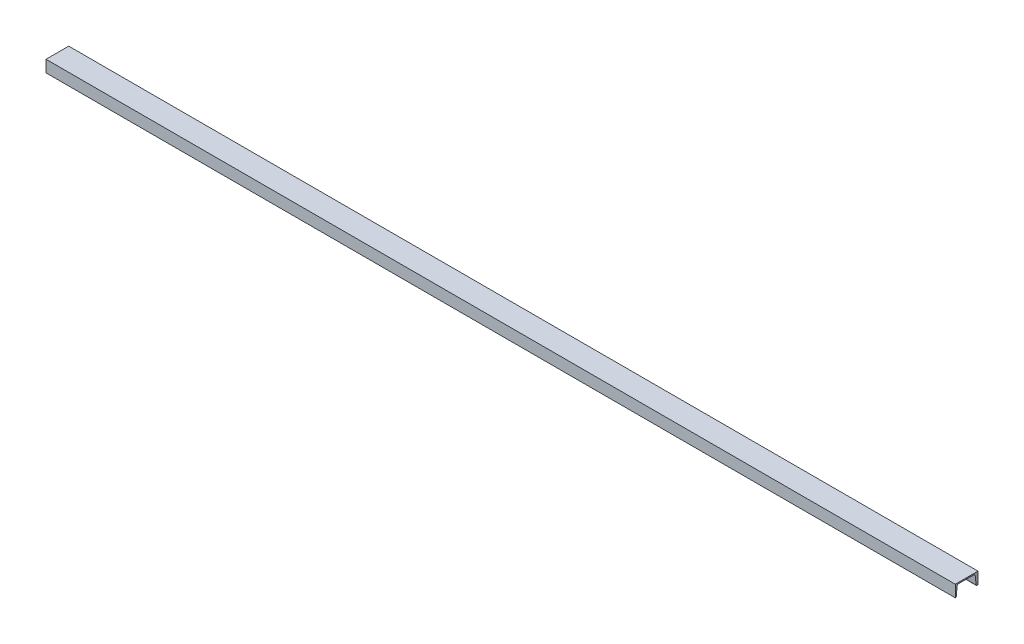
ISO-10303-21;
HEADER;
FILE_DESCRIPTION(('STEP AP214'),'2;1');
FILE_NAME('part.step','',(''),(''),'','','');
FILE_SCHEMA(('AUTOMOTIVE_DESIGN { 1 0 10303 214 1 1 1 1 }'));
ENDSEC;
DATA;
#1=APPLICATION_CONTEXT('core data for automotive mechanical design processes');
#2=APPLICATION_PROTOCOL_DEFINITION('international standard','automotive_design',2000,#1);
#3=PRODUCT_CONTEXT('',#1,'mechanical');
#4=PRODUCT('Part','Part','',(#3));
#5=PRODUCT_RELATED_PRODUCT_CATEGORY('part','',(#4));
#6=PRODUCT_DEFINITION_FORMATION('','',#4);
#7=PRODUCT_DEFINITION_CONTEXT('part definition',#1,'design');
#8=PRODUCT_DEFINITION('design','',#6,#7);
#9=PRODUCT_DEFINITION_SHAPE('','',#8);
#10=(LENGTH_UNIT() NAMED_UNIT(*) SI_UNIT(.MILLI.,.METRE.));
#11=(NAMED_UNIT(*) PLANE_ANGLE_UNIT() SI_UNIT($,.RADIAN.));
#12=(NAMED_UNIT(*) SI_UNIT($,.STERADIAN.) SOLID_ANGLE_UNIT());
#13=UNCERTAINTY_MEASURE_WITH_UNIT(LENGTH_MEASURE(1.E-05),#10,'distance_accuracy_value','');
#14=(GEOMETRIC_REPRESENTATION_CONTEXT(3) GLOBAL_UNCERTAINTY_ASSIGNED_CONTEXT((#13)) GLOBAL_UNIT_ASSIGNED_CONTEXT((#10,
#11,#12)) REPRESENTATION_CONTEXT('',''));
#15=CARTESIAN_POINT('',(0.,0.,0.));
#16=DIRECTION('',(0.,0.,1.));
#17=DIRECTION('',(1.,0.,0.));
#18=AXIS2_PLACEMENT_3D('',#15,#16,#17);
#19=CARTESIAN_POINT('',(-5005.,-60.5,124.164669163818));
#20=DIRECTION('',(1.,0.,0.));
#21=DIRECTION('',(0.,0.,-1.));
#22=AXIS2_PLACEMENT_3D('',#19,#20,#21);
#23=CYLINDRICAL_SURFACE('',#22,4.5);
#24=CARTESIAN_POINT('',(0.,-60.5,124.164669163818));
#25=DIRECTION('',(-1.,0.,0.));
#26=DIRECTION('',(0.,0.,1.));
#27=AXIS2_PLACEMENT_3D('',#24,#25,#26);
#28=CIRCLE('',#27,4.5);
#29=CARTESIAN_POINT('',(0.,-60.9703780847044,119.689320634661));
#30=VERTEX_POINT('',#29);
#31=CARTESIAN_POINT('',(0.,-65.,124.164669163818));
#32=VERTEX_POINT('',#31);
#33=EDGE_CURVE('E200',#30,#32,#28,.T.);
#34=ORIENTED_EDGE('',*,*,#33,.T.);
#35=DIRECTION('',(1.,0.,0.));
#36=VECTOR('',#35,1.);
#37=CARTESIAN_POINT('',(-5005.,-65.,124.164669163818));
#38=LINE('',#37,#36);
#39=CARTESIAN_POINT('',(-5005.,-65.,124.164669163818));
#40=VERTEX_POINT('',#39);
#41=EDGE_CURVE('E13',#40,#32,#38,.T.);
#42=ORIENTED_EDGE('',*,*,#41,.F.);
#43=CARTESIAN_POINT('',(-5005.,-60.5,124.164669163818));
#44=DIRECTION('',(-1.,0.,0.));
#45=DIRECTION('',(0.,0.,1.));
#46=AXIS2_PLACEMENT_3D('',#43,#44,#45);
#47=CIRCLE('',#46,4.5);
#48=CARTESIAN_POINT('',(-5005.,-60.9703780847044,119.689320634661));
#49=VERTEX_POINT('',#48);
#50=EDGE_CURVE('E222',#49,#40,#47,.T.);
#51=ORIENTED_EDGE('',*,*,#50,.F.);
#52=DIRECTION('',(1.,0.,0.));
#53=VECTOR('',#52,1.);
#54=CARTESIAN_POINT('',(-5005.,-60.9703780847044,119.689320634661));
#55=LINE('',#54,#53);
#56=EDGE_CURVE('E196',#49,#30,#55,.T.);
#57=ORIENTED_EDGE('',*,*,#56,.T.);
#58=EDGE_LOOP('',(#34,#42,#51,#57));
#59=FACE_BOUND('',#58,.T.);
#60=ADVANCED_FACE('F80',(#59),#23,.T.);
#61=CARTESIAN_POINT('',(-5005.,-65.,125.));
#62=DIRECTION('',(0.,1.,0.));
#63=DIRECTION('',(0.,0.,1.));
#64=AXIS2_PLACEMENT_3D('',#61,#62,#63);
#65=PLANE('',#64);
#66=DIRECTION('',(0.,0.,1.));
#67=VECTOR('',#66,1.);
#68=CARTESIAN_POINT('',(0.,-65.,125.));
#69=LINE('',#68,#67);
#70=CARTESIAN_POINT('',(0.,-65.,125.));
#71=VERTEX_POINT('',#70);
#72=EDGE_CURVE('E203',#32,#71,#69,.T.);
#73=ORIENTED_EDGE('',*,*,#72,.T.);
#74=DIRECTION('',(1.,0.,0.));
#75=VECTOR('',#74,1.);
#76=CARTESIAN_POINT('',(-5005.,-65.,125.));
#77=LINE('',#76,#75);
#78=CARTESIAN_POINT('',(-5005.,-65.,125.));
#79=VERTEX_POINT('',#78);
#80=EDGE_CURVE('E88',#79,#71,#77,.T.);
#81=ORIENTED_EDGE('',*,*,#80,.F.);
#82=DIRECTION('',(0.,0.,1.));
#83=VECTOR('',#82,1.);
#84=CARTESIAN_POINT('',(-5005.,-65.,125.));
#85=LINE('',#84,#83);
#86=EDGE_CURVE('E151',#40,#79,#85,.T.);
#87=ORIENTED_EDGE('',*,*,#86,.F.);
#88=ORIENTED_EDGE('',*,*,#41,.T.);
#89=EDGE_LOOP('',(#73,#81,#87,#88));
#90=FACE_BOUND('',#89,.T.);
#91=ADVANCED_FACE('F300',(#90),#65,.F.);
#92=CARTESIAN_POINT('',(-5005.,-65.,125.));
#93=DIRECTION('',(0.,0.,-1.));
#94=DIRECTION('',(0.,1.,0.));
#95=AXIS2_PLACEMENT_3D('',#92,#93,#94);
#96=PLANE('',#95);
#97=DIRECTION('',(0.,1.,0.));
#98=VECTOR('',#97,1.);
#99=CARTESIAN_POINT('',(0.,-65.,125.));
#100=LINE('',#99,#98);
#101=CARTESIAN_POINT('',(0.,0.,125.));
#102=VERTEX_POINT('',#101);
#103=EDGE_CURVE('E205',#71,#102,#100,.T.);
#104=ORIENTED_EDGE('',*,*,#103,.T.);
#105=DIRECTION('',(1.,0.,0.));
#106=VECTOR('',#105,1.);
#107=CARTESIAN_POINT('',(-5005.,0.,125.));
#108=LINE('',#107,#106);
#109=CARTESIAN_POINT('',(-5005.,0.,125.));
#110=VERTEX_POINT('',#109);
#111=EDGE_CURVE('E241',#110,#102,#108,.T.);
#112=ORIENTED_EDGE('',*,*,#111,.F.);
#113=DIRECTION('',(0.,1.,0.));
#114=VECTOR('',#113,1.);
#115=CARTESIAN_POINT('',(-5005.,-65.,125.));
#116=LINE('',#115,#114);
#117=EDGE_CURVE('E249',#79,#110,#116,.T.);
#118=ORIENTED_EDGE('',*,*,#117,.F.);
#119=ORIENTED_EDGE('',*,*,#80,.T.);
#120=EDGE_LOOP('',(#104,#112,#118,#119));
#121=FACE_BOUND('',#120,.T.);
#122=ADVANCED_FACE('F247',(#121),#96,.F.);
#123=CARTESIAN_POINT('',(-5005.,0.,125.));
#124=DIRECTION('',(0.,-1.,0.));
#125=DIRECTION('',(0.,0.,-1.));
#126=AXIS2_PLACEMENT_3D('',#123,#124,#125);
#127=PLANE('',#126);
#128=DIRECTION('',(0.,0.,-1.));
#129=VECTOR('',#128,1.);
#130=CARTESIAN_POINT('',(0.,0.,125.));
#131=LINE('',#130,#129);
#132=CARTESIAN_POINT('',(0.,0.,0.));
#133=VERTEX_POINT('',#132);
#134=EDGE_CURVE('E207',#102,#133,#131,.T.);
#135=ORIENTED_EDGE('',*,*,#134,.T.);
#136=DIRECTION('',(1.,0.,0.));
#137=VECTOR('',#136,1.);
#138=CARTESIAN_POINT('',(-5005.,0.,0.));
#139=LINE('',#138,#137);
#140=CARTESIAN_POINT('',(-5005.,0.,0.));
#141=VERTEX_POINT('',#140);
#142=EDGE_CURVE('E238',#141,#133,#139,.T.);
#143=ORIENTED_EDGE('',*,*,#142,.F.);
#144=DIRECTION('',(0.,0.,-1.));
#145=VECTOR('',#144,1.);
#146=CARTESIAN_POINT('',(-5005.,0.,125.));
#147=LINE('',#146,#145);
#148=EDGE_CURVE('E267',#110,#141,#147,.T.);
#149=ORIENTED_EDGE('',*,*,#148,.F.);
#150=ORIENTED_EDGE('',*,*,#111,.T.);
#151=EDGE_LOOP('',(#135,#143,#149,#150));
#152=FACE_BOUND('',#151,.T.);
#153=ADVANCED_FACE('F258',(#152),#127,.F.);
#154=CARTESIAN_POINT('',(-5005.,-65.,0.));
#155=DIRECTION('',(0.,0.,1.));
#156=DIRECTION('',(0.,-1.,0.));
#157=AXIS2_PLACEMENT_3D('',#154,#155,#156);
#158=PLANE('',#157);
#159=DIRECTION('',(0.,-1.,0.));
#160=VECTOR('',#159,1.);
#161=CARTESIAN_POINT('',(0.,-65.,0.));
#162=LINE('',#161,#160);
#163=CARTESIAN_POINT('',(0.,-65.,0.));
#164=VERTEX_POINT('',#163);
#165=EDGE_CURVE('E209',#133,#164,#162,.T.);
#166=ORIENTED_EDGE('',*,*,#165,.T.);
#167=DIRECTION('',(1.,0.,0.));
#168=VECTOR('',#167,1.);
#169=CARTESIAN_POINT('',(-5005.,-65.,0.));
#170=LINE('',#169,#168);
#171=CARTESIAN_POINT('',(-5005.,-65.,0.));
#172=VERTEX_POINT('',#171);
#173=EDGE_CURVE('E235',#172,#164,#170,.T.);
#174=ORIENTED_EDGE('',*,*,#173,.F.);
#175=DIRECTION('',(0.,-1.,0.));
#176=VECTOR('',#175,1.);
#177=CARTESIAN_POINT('',(-5005.,-65.,0.));
#178=LINE('',#177,#176);
#179=EDGE_CURVE('E264',#141,#172,#178,.T.);
#180=ORIENTED_EDGE('',*,*,#179,.F.);
#181=ORIENTED_EDGE('',*,*,#142,.T.);
#182=EDGE_LOOP('',(#166,#174,#180,#181));
#183=FACE_BOUND('',#182,.T.);
#184=ADVANCED_FACE('F262',(#183),#158,.F.);
#185=CARTESIAN_POINT('',(-5005.,-65.,0.));
#186=DIRECTION('',(0.,1.,0.));
#187=DIRECTION('',(0.,0.,1.));
#188=AXIS2_PLACEMENT_3D('',#185,#186,#187);
#189=PLANE('',#188);
#190=DIRECTION('',(0.,0.,1.));
#191=VECTOR('',#190,1.);
#192=CARTESIAN_POINT('',(0.,-65.,0.));
#193=LINE('',#192,#191);
#194=CARTESIAN_POINT('',(0.,-65.,5.84533083618209));
#195=VERTEX_POINT('',#194);
#196=EDGE_CURVE('E211',#164,#195,#193,.T.);
#197=ORIENTED_EDGE('',*,*,#196,.T.);
#198=DIRECTION('',(1.,0.,0.));
#199=VECTOR('',#198,1.);
#200=CARTESIAN_POINT('',(-5005.,-65.,5.84533083618209));
#201=LINE('',#200,#199);
#202=CARTESIAN_POINT('',(-5005.,-65.,5.84533083618209));
#203=VERTEX_POINT('',#202);
#204=EDGE_CURVE('E232',#203,#195,#201,.T.);
#205=ORIENTED_EDGE('',*,*,#204,.F.);
#206=DIRECTION('',(0.,0.,1.));
#207=VECTOR('',#206,1.);
#208=CARTESIAN_POINT('',(-5005.,-65.,0.));
#209=LINE('',#208,#207);
#210=EDGE_CURVE('E266',#172,#203,#209,.T.);
#211=ORIENTED_EDGE('',*,*,#210,.F.);
#212=ORIENTED_EDGE('',*,*,#173,.T.);
#213=EDGE_LOOP('',(#197,#205,#211,#212));
#214=FACE_BOUND('',#213,.T.);
#215=ADVANCED_FACE('F313',(#214),#189,.F.);
#216=CARTESIAN_POINT('',(-5005.,-60.5,5.84533083618209));
#217=DIRECTION('',(1.,0.,0.));
#218=DIRECTION('',(0.,0.,-1.));
#219=AXIS2_PLACEMENT_3D('',#216,#217,#218);
#220=CYLINDRICAL_SURFACE('',#219,4.5);
#221=CARTESIAN_POINT('',(0.,-60.5,5.84533083618209));
#222=DIRECTION('',(-1.,0.,0.));
#223=DIRECTION('',(0.,0.,-1.));
#224=AXIS2_PLACEMENT_3D('',#221,#222,#223);
#225=CIRCLE('',#224,4.5);
#226=CARTESIAN_POINT('',(0.,-60.9703780847044,10.3206793653393));
#227=VERTEX_POINT('',#226);
#228=EDGE_CURVE('E213',#195,#227,#225,.T.);
#229=ORIENTED_EDGE('',*,*,#228,.T.);
#230=DIRECTION('',(1.,0.,0.));
#231=VECTOR('',#230,1.);
#232=CARTESIAN_POINT('',(-5005.,-60.9703780847044,10.3206793653393));
#233=LINE('',#232,#231);
#234=CARTESIAN_POINT('',(-5005.,-60.9703780847044,10.3206793653393));
#235=VERTEX_POINT('',#234);
#236=EDGE_CURVE('E229',#235,#227,#233,.T.);
#237=ORIENTED_EDGE('',*,*,#236,.F.);
#238=CARTESIAN_POINT('',(-5005.,-60.5,5.84533083618209));
#239=DIRECTION('',(-1.,0.,0.));
#240=DIRECTION('',(0.,0.,-1.));
#241=AXIS2_PLACEMENT_3D('',#238,#239,#240);
#242=CIRCLE('',#241,4.5);
#243=EDGE_CURVE('E269',#203,#235,#242,.T.);
#244=ORIENTED_EDGE('',*,*,#243,.F.);
#245=ORIENTED_EDGE('',*,*,#204,.T.);
#246=EDGE_LOOP('',(#229,#237,#244,#245));
#247=FACE_BOUND('',#246,.T.);
#248=ADVANCED_FACE('F316',(#247),#220,.T.);
#249=CARTESIAN_POINT('',(-5005.,-13.4637722938588,15.3138248370538));
#250=DIRECTION('',(0.,0.104528463267647,-0.994521895368274));
#251=DIRECTION('',(0.,0.994521895368274,0.104528463267647));
#252=AXIS2_PLACEMENT_3D('',#249,#250,#251);
#253=PLANE('',#252);
#254=DIRECTION('',(0.,0.994521895368274,0.104528463267647));
#255=VECTOR('',#254,1.);
#256=CARTESIAN_POINT('',(0.,-13.4637722938588,15.3138248370538));
#257=LINE('',#256,#255);
#258=CARTESIAN_POINT('',(0.,-13.4637722938588,15.3138248370538));
#259=VERTEX_POINT('',#258);
#260=EDGE_CURVE('E215',#227,#259,#257,.T.);
#261=ORIENTED_EDGE('',*,*,#260,.T.);
#262=DIRECTION('',(1.,0.,0.));
#263=VECTOR('',#262,1.);
#264=CARTESIAN_POINT('',(-5005.,-13.4637722938588,15.3138248370538));
#265=LINE('',#264,#263);
#266=CARTESIAN_POINT('',(-5005.,-13.4637722938588,15.3138248370538));
#267=VERTEX_POINT('',#266);
#268=EDGE_CURVE('E226',#267,#259,#265,.T.);
#269=ORIENTED_EDGE('',*,*,#268,.F.);
#270=DIRECTION('',(0.,0.994521895368274,0.104528463267647));
#271=VECTOR('',#270,1.);
#272=CARTESIAN_POINT('',(-5005.,-13.4637722938588,15.3138248370538));
#273=LINE('',#272,#271);
#274=EDGE_CURVE('E275',#235,#267,#273,.T.);
#275=ORIENTED_EDGE('',*,*,#274,.F.);
#276=ORIENTED_EDGE('',*,*,#236,.T.);
#277=EDGE_LOOP('',(#261,#269,#275,#276));
#278=FACE_BOUND('',#277,.T.);
#279=ADVANCED_FACE('F281',(#278),#253,.F.);
#280=CARTESIAN_POINT('',(-5005.,-14.3,23.27));
#281=DIRECTION('',(1.,0.,0.));
#282=DIRECTION('',(0.,0.,-1.));
#283=AXIS2_PLACEMENT_3D('',#280,#281,#282);
#284=CYLINDRICAL_SURFACE('',#283,8.);
#285=CARTESIAN_POINT('',(0.,-14.3,23.27));
#286=DIRECTION('',(1.,0.,0.));
#287=DIRECTION('',(0.,0.,1.));
#288=AXIS2_PLACEMENT_3D('',#285,#286,#287);
#289=CIRCLE('',#288,8.);
#290=CARTESIAN_POINT('',(0.,-6.30000000000001,23.27));
#291=VERTEX_POINT('',#290);
#292=EDGE_CURVE('E217',#259,#291,#289,.T.);
#293=ORIENTED_EDGE('',*,*,#292,.T.);
#294=DIRECTION('',(1.,0.,0.));
#295=VECTOR('',#294,1.);
#296=CARTESIAN_POINT('',(-5005.,-6.30000000000001,23.27));
#297=LINE('',#296,#295);
#298=CARTESIAN_POINT('',(-5005.,-6.30000000000001,23.27));
#299=VERTEX_POINT('',#298);
#300=EDGE_CURVE('E191',#299,#291,#297,.T.);
#301=ORIENTED_EDGE('',*,*,#300,.F.);
#302=CARTESIAN_POINT('',(-5005.,-14.3,23.27));
#303=DIRECTION('',(1.,0.,0.));
#304=DIRECTION('',(0.,0.,1.));
#305=AXIS2_PLACEMENT_3D('',#302,#303,#304);
#306=CIRCLE('',#305,8.);
#307=EDGE_CURVE('E182',#267,#299,#306,.T.);
#308=ORIENTED_EDGE('',*,*,#307,.F.);
#309=ORIENTED_EDGE('',*,*,#268,.T.);
#310=EDGE_LOOP('',(#293,#301,#308,#309));
#311=FACE_BOUND('',#310,.T.);
#312=ADVANCED_FACE('F285',(#311),#284,.F.);
#313=CARTESIAN_POINT('',(-5005.,-6.3,106.74));
#314=DIRECTION('',(0.,1.,0.));
#315=DIRECTION('',(0.,0.,1.));
#316=AXIS2_PLACEMENT_3D('',#313,#314,#315);
#317=PLANE('',#316);
#318=DIRECTION('',(0.,0.,1.));
#319=VECTOR('',#318,1.);
#320=CARTESIAN_POINT('',(0.,-6.3,106.74));
#321=LINE('',#320,#319);
#322=CARTESIAN_POINT('',(0.,-6.3,106.74));
#323=VERTEX_POINT('',#322);
#324=EDGE_CURVE('E190',#291,#323,#321,.T.);
#325=ORIENTED_EDGE('',*,*,#324,.T.);
#326=DIRECTION('',(1.,0.,0.));
#327=VECTOR('',#326,1.);
#328=CARTESIAN_POINT('',(-5005.,-6.3,106.74));
#329=LINE('',#328,#327);
#330=CARTESIAN_POINT('',(-5005.,-6.3,106.74));
#331=VERTEX_POINT('',#330);
#332=EDGE_CURVE('E187',#331,#323,#329,.T.);
#333=ORIENTED_EDGE('',*,*,#332,.F.);
#334=DIRECTION('',(0.,0.,1.));
#335=VECTOR('',#334,1.);
#336=CARTESIAN_POINT('',(-5005.,-6.3,106.74));
#337=LINE('',#336,#335);
#338=EDGE_CURVE('E176',#299,#331,#337,.T.);
#339=ORIENTED_EDGE('',*,*,#338,.F.);
#340=ORIENTED_EDGE('',*,*,#300,.T.);
#341=EDGE_LOOP('',(#325,#333,#339,#340));
#342=FACE_BOUND('',#341,.T.);
#343=ADVANCED_FACE('F188',(#342),#317,.F.);
#344=CARTESIAN_POINT('',(-5005.,-14.3,106.74));
#345=DIRECTION('',(1.,0.,0.));
#346=DIRECTION('',(0.,0.,-1.));
#347=AXIS2_PLACEMENT_3D('',#344,#345,#346);
#348=CYLINDRICAL_SURFACE('',#347,8.);
#349=CARTESIAN_POINT('',(0.,-14.3,106.74));
#350=DIRECTION('',(1.,0.,0.));
#351=DIRECTION('',(0.,0.,-1.));
#352=AXIS2_PLACEMENT_3D('',#349,#350,#351);
#353=CIRCLE('',#352,8.);
#354=CARTESIAN_POINT('',(0.,-13.4637722938588,114.696175162946));
#355=VERTEX_POINT('',#354);
#356=EDGE_CURVE('E137',#323,#355,#353,.T.);
#357=ORIENTED_EDGE('',*,*,#356,.T.);
#358=DIRECTION('',(1.,0.,0.));
#359=VECTOR('',#358,1.);
#360=CARTESIAN_POINT('',(-5005.,-13.4637722938588,114.696175162946));
#361=LINE('',#360,#359);
#362=CARTESIAN_POINT('',(-5005.,-13.4637722938588,114.696175162946));
#363=VERTEX_POINT('',#362);
#364=EDGE_CURVE('E192',#363,#355,#361,.T.);
#365=ORIENTED_EDGE('',*,*,#364,.F.);
#366=CARTESIAN_POINT('',(-5005.,-14.3,106.74));
#367=DIRECTION('',(1.,0.,0.));
#368=DIRECTION('',(0.,0.,-1.));
#369=AXIS2_PLACEMENT_3D('',#366,#367,#368);
#370=CIRCLE('',#369,8.);
#371=EDGE_CURVE('E180',#331,#363,#370,.T.);
#372=ORIENTED_EDGE('',*,*,#371,.F.);
#373=ORIENTED_EDGE('',*,*,#332,.T.);
#374=EDGE_LOOP('',(#357,#365,#372,#373));
#375=FACE_BOUND('',#374,.T.);
#376=ADVANCED_FACE('F194',(#375),#348,.F.);
#377=CARTESIAN_POINT('',(-5005.,-13.4637722938588,114.696175162946));
#378=DIRECTION('',(0.,0.104528463267646,0.994521895368274));
#379=DIRECTION('',(0.,-0.994521895368274,0.104528463267646));
#380=AXIS2_PLACEMENT_3D('',#377,#378,#379);
#381=PLANE('',#380);
#382=DIRECTION('',(0.,-0.994521895368274,0.104528463267646));
#383=VECTOR('',#382,1.);
#384=CARTESIAN_POINT('',(0.,-13.4637722938588,114.696175162946));
#385=LINE('',#384,#383);
#386=EDGE_CURVE('E143',#355,#30,#385,.T.);
#387=ORIENTED_EDGE('',*,*,#386,.T.);
#388=ORIENTED_EDGE('',*,*,#56,.F.);
#389=DIRECTION('',(0.,-0.994521895368274,0.104528463267646));
#390=VECTOR('',#389,1.);
#391=CARTESIAN_POINT('',(-5005.,-13.4637722938588,114.696175162946));
#392=LINE('',#391,#390);
#393=EDGE_CURVE('E96',#363,#49,#392,.T.);
#394=ORIENTED_EDGE('',*,*,#393,.F.);
#395=ORIENTED_EDGE('',*,*,#364,.T.);
#396=EDGE_LOOP('',(#387,#388,#394,#395));
#397=FACE_BOUND('',#396,.T.);
#398=ADVANCED_FACE('F289',(#397),#381,.F.);
#399=CARTESIAN_POINT('',(-5005.,-60.5,124.164669163818));
#400=DIRECTION('',(-1.,0.,0.));
#401=DIRECTION('',(0.,0.,1.));
#402=AXIS2_PLACEMENT_3D('',#399,#400,#401);
#403=PLANE('',#402);
#404=ORIENTED_EDGE('',*,*,#50,.T.);
#405=ORIENTED_EDGE('',*,*,#86,.T.);
#406=ORIENTED_EDGE('',*,*,#117,.T.);
#407=ORIENTED_EDGE('',*,*,#148,.T.);
#408=ORIENTED_EDGE('',*,*,#179,.T.);
#409=ORIENTED_EDGE('',*,*,#210,.T.);
#410=ORIENTED_EDGE('',*,*,#243,.T.);
#411=ORIENTED_EDGE('',*,*,#274,.T.);
#412=ORIENTED_EDGE('',*,*,#307,.T.);
#413=ORIENTED_EDGE('',*,*,#338,.T.);
#414=ORIENTED_EDGE('',*,*,#371,.T.);
#415=ORIENTED_EDGE('',*,*,#393,.T.);
#416=EDGE_LOOP('',(#404,#405,#406,#407,#408,#409,#410,#411,#412,#413,#414,#415));
#417=FACE_BOUND('',#416,.T.);
#418=ADVANCED_FACE('F178',(#417),#403,.T.);
#419=CARTESIAN_POINT('',(0.,-60.5,124.164669163818));
#420=DIRECTION('',(-1.,0.,0.));
#421=DIRECTION('',(0.,0.,1.));
#422=AXIS2_PLACEMENT_3D('',#419,#420,#421);
#423=PLANE('',#422);
#424=ORIENTED_EDGE('',*,*,#33,.F.);
#425=ORIENTED_EDGE('',*,*,#386,.F.);
#426=ORIENTED_EDGE('',*,*,#356,.F.);
#427=ORIENTED_EDGE('',*,*,#324,.F.);
#428=ORIENTED_EDGE('',*,*,#292,.F.);
#429=ORIENTED_EDGE('',*,*,#260,.F.);
#430=ORIENTED_EDGE('',*,*,#228,.F.);
#431=ORIENTED_EDGE('',*,*,#196,.F.);
#432=ORIENTED_EDGE('',*,*,#165,.F.);
#433=ORIENTED_EDGE('',*,*,#134,.F.);
#434=ORIENTED_EDGE('',*,*,#103,.F.);
#435=ORIENTED_EDGE('',*,*,#72,.F.);
#436=EDGE_LOOP('',(#424,#425,#426,#427,#428,#429,#430,#431,#432,#433,#434,#435));
#437=FACE_BOUND('',#436,.T.);
#438=ADVANCED_FACE('F253',(#437),#423,.F.);
#439=CLOSED_SHELL('',(#60,#91,#122,#153,#184,#215,#248,#279,#312,#343,#376,#398,#418,#438));
#440=MANIFOLD_SOLID_BREP('B2',#439);
#441=ADVANCED_BREP_SHAPE_REPRESENTATION('',(#18,#440),#14);
#442=SHAPE_DEFINITION_REPRESENTATION(#9,#441);
ENDSEC;
END-ISO-10303-21;
